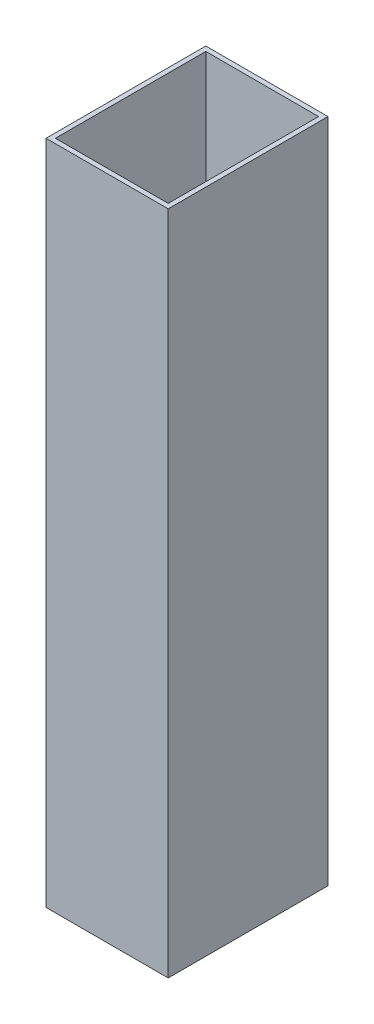
ISO-10303-21;
HEADER;
FILE_DESCRIPTION(('STEP AP214'),'2;1');
FILE_NAME('part.step','',(''),(''),'','','');
FILE_SCHEMA(('AUTOMOTIVE_DESIGN { 1 0 10303 214 1 1 1 1 }'));
ENDSEC;
DATA;
#1=APPLICATION_CONTEXT('core data for automotive mechanical design processes');
#2=APPLICATION_PROTOCOL_DEFINITION('international standard','automotive_design',2000,#1);
#3=PRODUCT_CONTEXT('',#1,'mechanical');
#4=PRODUCT('Part','Part','',(#3));
#5=PRODUCT_RELATED_PRODUCT_CATEGORY('part','',(#4));
#6=PRODUCT_DEFINITION_FORMATION('','',#4);
#7=PRODUCT_DEFINITION_CONTEXT('part definition',#1,'design');
#8=PRODUCT_DEFINITION('design','',#6,#7);
#9=PRODUCT_DEFINITION_SHAPE('','',#8);
#10=(LENGTH_UNIT() NAMED_UNIT(*) SI_UNIT(.MILLI.,.METRE.));
#11=(NAMED_UNIT(*) PLANE_ANGLE_UNIT() SI_UNIT($,.RADIAN.));
#12=(NAMED_UNIT(*) SI_UNIT($,.STERADIAN.) SOLID_ANGLE_UNIT());
#13=UNCERTAINTY_MEASURE_WITH_UNIT(LENGTH_MEASURE(1.E-05),#10,'distance_accuracy_value','');
#14=(GEOMETRIC_REPRESENTATION_CONTEXT(3) GLOBAL_UNCERTAINTY_ASSIGNED_CONTEXT((#13)) GLOBAL_UNIT_ASSIGNED_CONTEXT((#10,
#11,#12)) REPRESENTATION_CONTEXT('',''));
#15=CARTESIAN_POINT('',(0.,0.,0.));
#16=DIRECTION('',(0.,0.,1.));
#17=DIRECTION('',(1.,0.,0.));
#18=AXIS2_PLACEMENT_3D('',#15,#16,#17);
#19=CARTESIAN_POINT('',(-41.275,225.,107.95));
#20=DIRECTION('',(1.,0.,0.));
#21=DIRECTION('',(0.,0.,-1.));
#22=AXIS2_PLACEMENT_3D('',#19,#20,#21);
#23=PLANE('',#22);
#24=DIRECTION('',(0.,-1.,0.));
#25=VECTOR('',#24,1.);
#26=CARTESIAN_POINT('',(-41.275,225.,0.));
#27=LINE('',#26,#25);
#28=CARTESIAN_POINT('',(-41.275,225.,0.));
#29=VERTEX_POINT('',#28);
#30=CARTESIAN_POINT('',(-41.275,-225.,0.));
#31=VERTEX_POINT('',#30);
#32=EDGE_CURVE('E130',#29,#31,#27,.T.);
#33=ORIENTED_EDGE('',*,*,#32,.T.);
#34=DIRECTION('',(0.,0.,-1.));
#35=VECTOR('',#34,1.);
#36=CARTESIAN_POINT('',(-41.275,-225.,107.95));
#37=LINE('',#36,#35);
#38=CARTESIAN_POINT('',(-41.275,-225.,107.95));
#39=VERTEX_POINT('',#38);
#40=EDGE_CURVE('E11',#39,#31,#37,.T.);
#41=ORIENTED_EDGE('',*,*,#40,.F.);
#42=DIRECTION('',(0.,-1.,0.));
#43=VECTOR('',#42,1.);
#44=CARTESIAN_POINT('',(-41.275,225.,107.95));
#45=LINE('',#44,#43);
#46=CARTESIAN_POINT('',(-41.275,225.,107.95));
#47=VERTEX_POINT('',#46);
#48=EDGE_CURVE('E132',#47,#39,#45,.T.);
#49=ORIENTED_EDGE('',*,*,#48,.F.);
#50=DIRECTION('',(0.,0.,-1.));
#51=VECTOR('',#50,1.);
#52=CARTESIAN_POINT('',(-41.275,225.,107.95));
#53=LINE('',#52,#51);
#54=EDGE_CURVE('E142',#47,#29,#53,.T.);
#55=ORIENTED_EDGE('',*,*,#54,.T.);
#56=EDGE_LOOP('',(#33,#41,#49,#55));
#57=FACE_BOUND('',#56,.T.);
#58=ADVANCED_FACE('F36',(#57),#23,.F.);
#59=CARTESIAN_POINT('',(-41.275,-225.,107.95));
#60=DIRECTION('',(0.,1.,0.));
#61=DIRECTION('',(0.,0.,1.));
#62=AXIS2_PLACEMENT_3D('',#59,#60,#61);
#63=PLANE('',#62);
#64=DIRECTION('',(1.,0.,0.));
#65=VECTOR('',#64,1.);
#66=CARTESIAN_POINT('',(-38.1,-225.,3.175));
#67=LINE('',#66,#65);
#68=CARTESIAN_POINT('',(-38.1,-225.,3.175));
#69=VERTEX_POINT('',#68);
#70=CARTESIAN_POINT('',(38.1,-225.,3.175));
#71=VERTEX_POINT('',#70);
#72=EDGE_CURVE('E202',#69,#71,#67,.T.);
#73=ORIENTED_EDGE('',*,*,#72,.F.);
#74=DIRECTION('',(0.,0.,-1.));
#75=VECTOR('',#74,1.);
#76=CARTESIAN_POINT('',(-38.1,-225.,3.175));
#77=LINE('',#76,#75);
#78=CARTESIAN_POINT('',(-38.1,-225.,104.775));
#79=VERTEX_POINT('',#78);
#80=EDGE_CURVE('E131',#79,#69,#77,.T.);
#81=ORIENTED_EDGE('',*,*,#80,.F.);
#82=DIRECTION('',(-1.,0.,0.));
#83=VECTOR('',#82,1.);
#84=CARTESIAN_POINT('',(-38.1,-225.,104.775));
#85=LINE('',#84,#83);
#86=CARTESIAN_POINT('',(38.1,-225.,104.775));
#87=VERTEX_POINT('',#86);
#88=EDGE_CURVE('E128',#87,#79,#85,.T.);
#89=ORIENTED_EDGE('',*,*,#88,.F.);
#90=DIRECTION('',(0.,0.,1.));
#91=VECTOR('',#90,1.);
#92=CARTESIAN_POINT('',(38.1,-225.,3.175));
#93=LINE('',#92,#91);
#94=EDGE_CURVE('E106',#71,#87,#93,.T.);
#95=ORIENTED_EDGE('',*,*,#94,.F.);
#96=EDGE_LOOP('',(#73,#81,#89,#95));
#97=FACE_BOUND('',#96,.T.);
#98=DIRECTION('',(1.,0.,0.));
#99=VECTOR('',#98,1.);
#100=CARTESIAN_POINT('',(-41.275,-225.,0.));
#101=LINE('',#100,#99);
#102=CARTESIAN_POINT('',(41.275,-225.,0.));
#103=VERTEX_POINT('',#102);
#104=EDGE_CURVE('E145',#31,#103,#101,.T.);
#105=ORIENTED_EDGE('',*,*,#104,.T.);
#106=DIRECTION('',(0.,0.,-1.));
#107=VECTOR('',#106,1.);
#108=CARTESIAN_POINT('',(41.275,-225.,107.95));
#109=LINE('',#108,#107);
#110=CARTESIAN_POINT('',(41.275,-225.,107.95));
#111=VERTEX_POINT('',#110);
#112=EDGE_CURVE('E43',#111,#103,#109,.T.);
#113=ORIENTED_EDGE('',*,*,#112,.F.);
#114=DIRECTION('',(1.,0.,0.));
#115=VECTOR('',#114,1.);
#116=CARTESIAN_POINT('',(-41.275,-225.,107.95));
#117=LINE('',#116,#115);
#118=EDGE_CURVE('E135',#39,#111,#117,.T.);
#119=ORIENTED_EDGE('',*,*,#118,.F.);
#120=ORIENTED_EDGE('',*,*,#40,.T.);
#121=EDGE_LOOP('',(#105,#113,#119,#120));
#122=FACE_BOUND('',#121,.T.);
#123=ADVANCED_FACE('F173',(#97,#122),#63,.F.);
#124=CARTESIAN_POINT('',(41.275,225.,107.95));
#125=DIRECTION('',(-1.,0.,0.));
#126=DIRECTION('',(0.,-1.,0.));
#127=AXIS2_PLACEMENT_3D('',#124,#125,#126);
#128=PLANE('',#127);
#129=DIRECTION('',(0.,1.,0.));
#130=VECTOR('',#129,1.);
#131=CARTESIAN_POINT('',(41.275,225.,0.));
#132=LINE('',#131,#130);
#133=CARTESIAN_POINT('',(41.275,225.,0.));
#134=VERTEX_POINT('',#133);
#135=EDGE_CURVE('E147',#103,#134,#132,.T.);
#136=ORIENTED_EDGE('',*,*,#135,.T.);
#137=DIRECTION('',(0.,0.,-1.));
#138=VECTOR('',#137,1.);
#139=CARTESIAN_POINT('',(41.275,225.,107.95));
#140=LINE('',#139,#138);
#141=CARTESIAN_POINT('',(41.275,225.,107.95));
#142=VERTEX_POINT('',#141);
#143=EDGE_CURVE('E152',#142,#134,#140,.T.);
#144=ORIENTED_EDGE('',*,*,#143,.F.);
#145=DIRECTION('',(0.,1.,0.));
#146=VECTOR('',#145,1.);
#147=CARTESIAN_POINT('',(41.275,225.,107.95));
#148=LINE('',#147,#146);
#149=EDGE_CURVE('E138',#111,#142,#148,.T.);
#150=ORIENTED_EDGE('',*,*,#149,.F.);
#151=ORIENTED_EDGE('',*,*,#112,.T.);
#152=EDGE_LOOP('',(#136,#144,#150,#151));
#153=FACE_BOUND('',#152,.T.);
#154=ADVANCED_FACE('F159',(#153),#128,.F.);
#155=CARTESIAN_POINT('',(-41.275,225.,107.95));
#156=DIRECTION('',(0.,-1.,0.));
#157=DIRECTION('',(0.,0.,-1.));
#158=AXIS2_PLACEMENT_3D('',#155,#156,#157);
#159=PLANE('',#158);
#160=DIRECTION('',(1.,0.,0.));
#161=VECTOR('',#160,1.);
#162=CARTESIAN_POINT('',(-38.1,225.,104.775));
#163=LINE('',#162,#161);
#164=CARTESIAN_POINT('',(-38.1,225.,104.775));
#165=VERTEX_POINT('',#164);
#166=CARTESIAN_POINT('',(38.1,225.,104.775));
#167=VERTEX_POINT('',#166);
#168=EDGE_CURVE('E112',#165,#167,#163,.T.);
#169=ORIENTED_EDGE('',*,*,#168,.F.);
#170=DIRECTION('',(0.,0.,1.));
#171=VECTOR('',#170,1.);
#172=CARTESIAN_POINT('',(-38.1,225.,3.175));
#173=LINE('',#172,#171);
#174=CARTESIAN_POINT('',(-38.1,225.,3.175));
#175=VERTEX_POINT('',#174);
#176=EDGE_CURVE('E58',#175,#165,#173,.T.);
#177=ORIENTED_EDGE('',*,*,#176,.F.);
#178=DIRECTION('',(-1.,0.,0.));
#179=VECTOR('',#178,1.);
#180=CARTESIAN_POINT('',(-38.1,225.,3.175));
#181=LINE('',#180,#179);
#182=CARTESIAN_POINT('',(38.1,225.,3.175));
#183=VERTEX_POINT('',#182);
#184=EDGE_CURVE('E119',#183,#175,#181,.T.);
#185=ORIENTED_EDGE('',*,*,#184,.F.);
#186=DIRECTION('',(0.,0.,-1.));
#187=VECTOR('',#186,1.);
#188=CARTESIAN_POINT('',(38.1,225.,3.175));
#189=LINE('',#188,#187);
#190=EDGE_CURVE('E103',#167,#183,#189,.T.);
#191=ORIENTED_EDGE('',*,*,#190,.F.);
#192=EDGE_LOOP('',(#169,#177,#185,#191));
#193=FACE_BOUND('',#192,.T.);
#194=DIRECTION('',(-1.,0.,0.));
#195=VECTOR('',#194,1.);
#196=CARTESIAN_POINT('',(-41.275,225.,0.));
#197=LINE('',#196,#195);
#198=EDGE_CURVE('E136',#134,#29,#197,.T.);
#199=ORIENTED_EDGE('',*,*,#198,.T.);
#200=ORIENTED_EDGE('',*,*,#54,.F.);
#201=DIRECTION('',(-1.,0.,0.));
#202=VECTOR('',#201,1.);
#203=CARTESIAN_POINT('',(-41.275,225.,107.95));
#204=LINE('',#203,#202);
#205=EDGE_CURVE('E140',#142,#47,#204,.T.);
#206=ORIENTED_EDGE('',*,*,#205,.F.);
#207=ORIENTED_EDGE('',*,*,#143,.T.);
#208=EDGE_LOOP('',(#199,#200,#206,#207));
#209=FACE_BOUND('',#208,.T.);
#210=ADVANCED_FACE('F116',(#193,#209),#159,.F.);
#211=CARTESIAN_POINT('',(0.,0.,107.95));
#212=DIRECTION('',(0.,0.,1.));
#213=DIRECTION('',(1.,0.,0.));
#214=AXIS2_PLACEMENT_3D('',#211,#212,#213);
#215=PLANE('',#214);
#216=ORIENTED_EDGE('',*,*,#48,.T.);
#217=ORIENTED_EDGE('',*,*,#118,.T.);
#218=ORIENTED_EDGE('',*,*,#149,.T.);
#219=ORIENTED_EDGE('',*,*,#205,.T.);
#220=EDGE_LOOP('',(#216,#217,#218,#219));
#221=FACE_BOUND('',#220,.T.);
#222=ADVANCED_FACE('F172',(#221),#215,.T.);
#223=CARTESIAN_POINT('',(0.,0.,0.));
#224=DIRECTION('',(0.,0.,1.));
#225=DIRECTION('',(1.,0.,0.));
#226=AXIS2_PLACEMENT_3D('',#223,#224,#225);
#227=PLANE('',#226);
#228=ORIENTED_EDGE('',*,*,#32,.F.);
#229=ORIENTED_EDGE('',*,*,#198,.F.);
#230=ORIENTED_EDGE('',*,*,#135,.F.);
#231=ORIENTED_EDGE('',*,*,#104,.F.);
#232=EDGE_LOOP('',(#228,#229,#230,#231));
#233=FACE_BOUND('',#232,.T.);
#234=ADVANCED_FACE('F165',(#233),#227,.F.);
#235=CARTESIAN_POINT('',(-38.1,-352.,3.175));
#236=DIRECTION('',(-1.,0.,0.));
#237=DIRECTION('',(0.,0.,1.));
#238=AXIS2_PLACEMENT_3D('',#235,#236,#237);
#239=PLANE('',#238);
#240=ORIENTED_EDGE('',*,*,#80,.T.);
#241=DIRECTION('',(0.,1.,0.));
#242=VECTOR('',#241,1.);
#243=CARTESIAN_POINT('',(-38.1,-352.,3.175));
#244=LINE('',#243,#242);
#245=EDGE_CURVE('E124',#69,#175,#244,.T.);
#246=ORIENTED_EDGE('',*,*,#245,.T.);
#247=ORIENTED_EDGE('',*,*,#176,.T.);
#248=DIRECTION('',(0.,1.,0.));
#249=VECTOR('',#248,1.);
#250=CARTESIAN_POINT('',(-38.1,-352.,104.775));
#251=LINE('',#250,#249);
#252=EDGE_CURVE('E109',#79,#165,#251,.T.);
#253=ORIENTED_EDGE('',*,*,#252,.F.);
#254=EDGE_LOOP('',(#240,#246,#247,#253));
#255=FACE_BOUND('',#254,.T.);
#256=ADVANCED_FACE('F187',(#255),#239,.F.);
#257=CARTESIAN_POINT('',(-38.1,-352.,3.175));
#258=DIRECTION('',(0.,0.,-1.));
#259=DIRECTION('',(-1.,0.,0.));
#260=AXIS2_PLACEMENT_3D('',#257,#258,#259);
#261=PLANE('',#260);
#262=ORIENTED_EDGE('',*,*,#72,.T.);
#263=DIRECTION('',(0.,1.,0.));
#264=VECTOR('',#263,1.);
#265=CARTESIAN_POINT('',(38.1,-352.,3.175));
#266=LINE('',#265,#264);
#267=EDGE_CURVE('E108',#71,#183,#266,.T.);
#268=ORIENTED_EDGE('',*,*,#267,.T.);
#269=ORIENTED_EDGE('',*,*,#184,.T.);
#270=ORIENTED_EDGE('',*,*,#245,.F.);
#271=EDGE_LOOP('',(#262,#268,#269,#270));
#272=FACE_BOUND('',#271,.T.);
#273=ADVANCED_FACE('F192',(#272),#261,.F.);
#274=CARTESIAN_POINT('',(38.1,-352.,3.175));
#275=DIRECTION('',(1.,0.,0.));
#276=DIRECTION('',(0.,0.,-1.));
#277=AXIS2_PLACEMENT_3D('',#274,#275,#276);
#278=PLANE('',#277);
#279=ORIENTED_EDGE('',*,*,#94,.T.);
#280=DIRECTION('',(0.,1.,0.));
#281=VECTOR('',#280,1.);
#282=CARTESIAN_POINT('',(38.1,-352.,104.775));
#283=LINE('',#282,#281);
#284=EDGE_CURVE('E50',#87,#167,#283,.T.);
#285=ORIENTED_EDGE('',*,*,#284,.T.);
#286=ORIENTED_EDGE('',*,*,#190,.T.);
#287=ORIENTED_EDGE('',*,*,#267,.F.);
#288=EDGE_LOOP('',(#279,#285,#286,#287));
#289=FACE_BOUND('',#288,.T.);
#290=ADVANCED_FACE('F100',(#289),#278,.F.);
#291=CARTESIAN_POINT('',(-38.1,-352.,104.775));
#292=DIRECTION('',(0.,0.,1.));
#293=DIRECTION('',(1.,0.,0.));
#294=AXIS2_PLACEMENT_3D('',#291,#292,#293);
#295=PLANE('',#294);
#296=ORIENTED_EDGE('',*,*,#88,.T.);
#297=ORIENTED_EDGE('',*,*,#252,.T.);
#298=ORIENTED_EDGE('',*,*,#168,.T.);
#299=ORIENTED_EDGE('',*,*,#284,.F.);
#300=EDGE_LOOP('',(#296,#297,#298,#299));
#301=FACE_BOUND('',#300,.T.);
#302=ADVANCED_FACE('F113',(#301),#295,.F.);
#303=CLOSED_SHELL('',(#58,#123,#154,#210,#222,#234,#256,#273,#290,#302));
#304=MANIFOLD_SOLID_BREP('B2',#303);
#305=ADVANCED_BREP_SHAPE_REPRESENTATION('',(#18,#304),#14);
#306=SHAPE_DEFINITION_REPRESENTATION(#9,#305);
ENDSEC;
END-ISO-10303-21;
